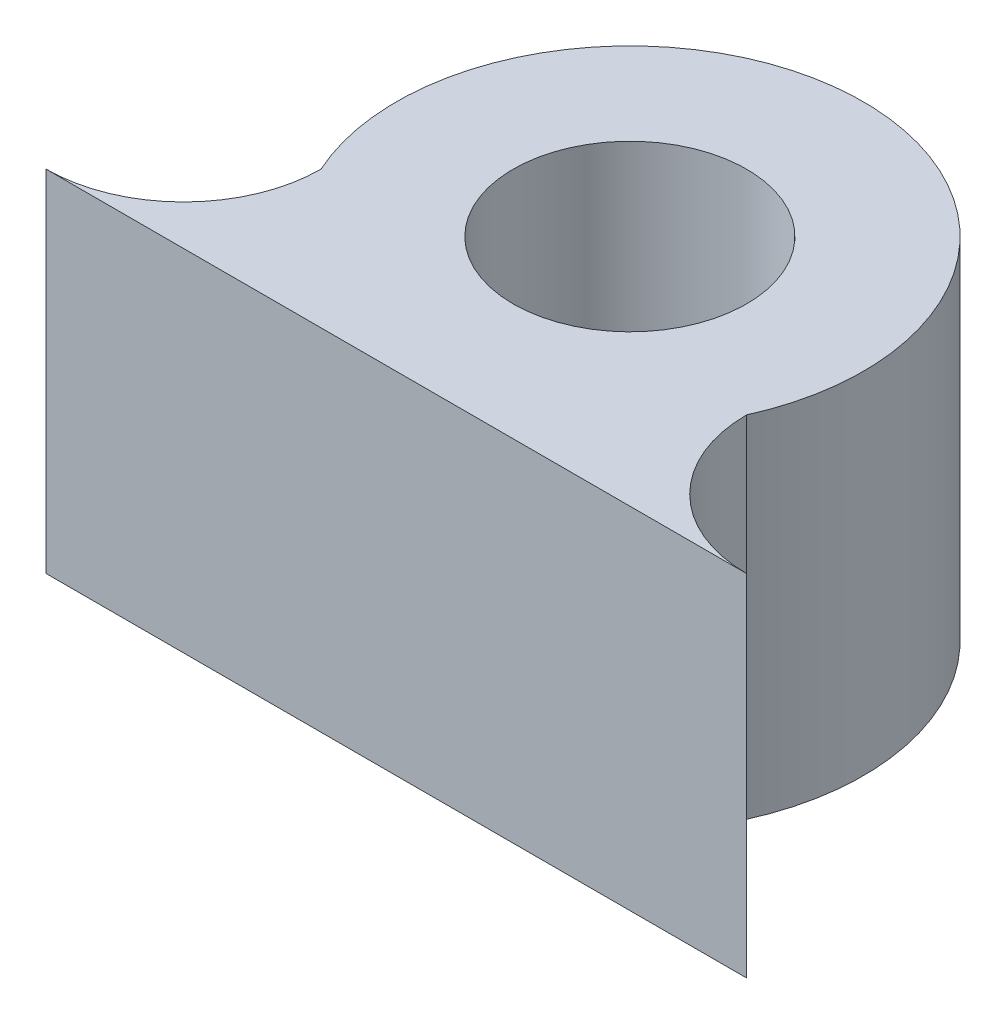
ISO-10303-21;
HEADER;
FILE_DESCRIPTION(('STEP AP214'),'2;1');
FILE_NAME('part.step','',(''),(''),'','','');
FILE_SCHEMA(('AUTOMOTIVE_DESIGN { 1 0 10303 214 1 1 1 1 }'));
ENDSEC;
DATA;
#1=APPLICATION_CONTEXT('core data for automotive mechanical design processes');
#2=APPLICATION_PROTOCOL_DEFINITION('international standard','automotive_design',2000,#1);
#3=PRODUCT_CONTEXT('',#1,'mechanical');
#4=PRODUCT('Part','Part','',(#3));
#5=PRODUCT_RELATED_PRODUCT_CATEGORY('part','',(#4));
#6=PRODUCT_DEFINITION_FORMATION('','',#4);
#7=PRODUCT_DEFINITION_CONTEXT('part definition',#1,'design');
#8=PRODUCT_DEFINITION('design','',#6,#7);
#9=PRODUCT_DEFINITION_SHAPE('','',#8);
#10=(LENGTH_UNIT() NAMED_UNIT(*) SI_UNIT(.MILLI.,.METRE.));
#11=(NAMED_UNIT(*) PLANE_ANGLE_UNIT() SI_UNIT($,.RADIAN.));
#12=(NAMED_UNIT(*) SI_UNIT($,.STERADIAN.) SOLID_ANGLE_UNIT());
#13=UNCERTAINTY_MEASURE_WITH_UNIT(LENGTH_MEASURE(1.E-05),#10,'distance_accuracy_value','');
#14=(GEOMETRIC_REPRESENTATION_CONTEXT(3) GLOBAL_UNCERTAINTY_ASSIGNED_CONTEXT((#13)) GLOBAL_UNIT_ASSIGNED_CONTEXT((#10,
#11,#12)) REPRESENTATION_CONTEXT('',''));
#15=CARTESIAN_POINT('',(0.,0.,0.));
#16=DIRECTION('',(0.,0.,1.));
#17=DIRECTION('',(1.,0.,0.));
#18=AXIS2_PLACEMENT_3D('',#15,#16,#17);
#19=CARTESIAN_POINT('',(0.,3.,0.));
#20=DIRECTION('',(0.,-1.,0.));
#21=DIRECTION('',(0.,0.,-1.));
#22=AXIS2_PLACEMENT_3D('',#19,#20,#21);
#23=CYLINDRICAL_SURFACE('',#22,2.);
#24=CARTESIAN_POINT('',(0.,3.,0.));
#25=DIRECTION('',(0.,1.,0.));
#26=DIRECTION('',(0.,0.,1.));
#27=AXIS2_PLACEMENT_3D('',#24,#25,#26);
#28=CIRCLE('',#27,2.);
#29=CARTESIAN_POINT('',(1.8228756555323,3.,0.822875655532295));
#30=VERTEX_POINT('',#29);
#31=CARTESIAN_POINT('',(-1.82287565553229,3.,0.822875655532296));
#32=VERTEX_POINT('',#31);
#33=EDGE_CURVE('E12',#30,#32,#28,.T.);
#34=ORIENTED_EDGE('',*,*,#33,.F.);
#35=DIRECTION('',(0.,1.,0.));
#36=VECTOR('',#35,1.);
#37=CARTESIAN_POINT('',(1.8228756555323,0.,0.822875655532295));
#38=LINE('',#37,#36);
#39=CARTESIAN_POINT('',(1.8228756555323,0.,0.822875655532295));
#40=VERTEX_POINT('',#39);
#41=EDGE_CURVE('E127',#40,#30,#38,.T.);
#42=ORIENTED_EDGE('',*,*,#41,.F.);
#43=CARTESIAN_POINT('',(0.,0.,0.));
#44=DIRECTION('',(0.,1.,0.));
#45=DIRECTION('',(0.,0.,1.));
#46=AXIS2_PLACEMENT_3D('',#43,#44,#45);
#47=CIRCLE('',#46,2.);
#48=CARTESIAN_POINT('',(-1.82287565553229,0.,0.822875655532296));
#49=VERTEX_POINT('',#48);
#50=EDGE_CURVE('E68',#40,#49,#47,.T.);
#51=ORIENTED_EDGE('',*,*,#50,.T.);
#52=DIRECTION('',(0.,1.,0.));
#53=VECTOR('',#52,1.);
#54=CARTESIAN_POINT('',(-1.82287565553229,0.,0.822875655532296));
#55=LINE('',#54,#53);
#56=EDGE_CURVE('E142',#49,#32,#55,.T.);
#57=ORIENTED_EDGE('',*,*,#56,.T.);
#58=EDGE_LOOP('',(#34,#42,#51,#57));
#59=FACE_BOUND('',#58,.T.);
#60=ADVANCED_FACE('F65',(#59),#23,.T.);
#61=CARTESIAN_POINT('',(0.,3.,0.));
#62=DIRECTION('',(0.,1.,0.));
#63=DIRECTION('',(0.,0.,1.));
#64=AXIS2_PLACEMENT_3D('',#61,#62,#63);
#65=PLANE('',#64);
#66=DIRECTION('',(-1.,0.,0.));
#67=VECTOR('',#66,1.);
#68=CARTESIAN_POINT('',(0.,3.,2.));
#69=LINE('',#68,#67);
#70=CARTESIAN_POINT('',(3.,3.,2.));
#71=VERTEX_POINT('',#70);
#72=CARTESIAN_POINT('',(-3.,3.,2.));
#73=VERTEX_POINT('',#72);
#74=EDGE_CURVE('E93',#71,#73,#69,.T.);
#75=ORIENTED_EDGE('',*,*,#74,.F.);
#76=CARTESIAN_POINT('',(3.,3.,0.822875655532295));
#77=DIRECTION('',(0.,1.,0.));
#78=DIRECTION('',(0.,0.,1.));
#79=AXIS2_PLACEMENT_3D('',#76,#77,#78);
#80=CIRCLE('',#79,1.17712434446771);
#81=EDGE_CURVE('E115',#71,#30,#80,.F.);
#82=ORIENTED_EDGE('',*,*,#81,.T.);
#83=ORIENTED_EDGE('',*,*,#33,.T.);
#84=CARTESIAN_POINT('',(-3.,3.,0.822875655532296));
#85=DIRECTION('',(0.,1.,0.));
#86=DIRECTION('',(0.,0.,1.));
#87=AXIS2_PLACEMENT_3D('',#84,#85,#86);
#88=CIRCLE('',#87,1.17712434446771);
#89=EDGE_CURVE('E118',#73,#32,#88,.T.);
#90=ORIENTED_EDGE('',*,*,#89,.F.);
#91=EDGE_LOOP('',(#75,#82,#83,#90));
#92=FACE_BOUND('',#91,.T.);
#93=CARTESIAN_POINT('',(0.,3.,0.));
#94=DIRECTION('',(0.,1.,0.));
#95=DIRECTION('',(0.,0.,1.));
#96=AXIS2_PLACEMENT_3D('',#93,#94,#95);
#97=CIRCLE('',#96,1.);
#98=CARTESIAN_POINT('',(0.,3.,1.));
#99=VERTEX_POINT('',#98);
#100=EDGE_CURVE('E148',#99,#99,#97,.T.);
#101=ORIENTED_EDGE('',*,*,#100,.F.);
#102=EDGE_LOOP('',(#101));
#103=FACE_BOUND('',#102,.T.);
#104=ADVANCED_FACE('F112',(#92,#103),#65,.T.);
#105=CARTESIAN_POINT('',(0.,0.,0.));
#106=DIRECTION('',(0.,1.,0.));
#107=DIRECTION('',(0.,0.,1.));
#108=AXIS2_PLACEMENT_3D('',#105,#106,#107);
#109=PLANE('',#108);
#110=ORIENTED_EDGE('',*,*,#50,.F.);
#111=CARTESIAN_POINT('',(3.,0.,0.822875655532295));
#112=DIRECTION('',(0.,1.,0.));
#113=DIRECTION('',(0.,0.,1.));
#114=AXIS2_PLACEMENT_3D('',#111,#112,#113);
#115=CIRCLE('',#114,1.17712434446771);
#116=CARTESIAN_POINT('',(3.,0.,2.));
#117=VERTEX_POINT('',#116);
#118=EDGE_CURVE('E102',#117,#40,#115,.F.);
#119=ORIENTED_EDGE('',*,*,#118,.F.);
#120=DIRECTION('',(-1.,0.,0.));
#121=VECTOR('',#120,1.);
#122=CARTESIAN_POINT('',(0.,0.,2.));
#123=LINE('',#122,#121);
#124=CARTESIAN_POINT('',(-3.,0.,2.));
#125=VERTEX_POINT('',#124);
#126=EDGE_CURVE('E108',#117,#125,#123,.T.);
#127=ORIENTED_EDGE('',*,*,#126,.T.);
#128=CARTESIAN_POINT('',(-3.,0.,0.822875655532296));
#129=DIRECTION('',(0.,1.,0.));
#130=DIRECTION('',(0.,0.,1.));
#131=AXIS2_PLACEMENT_3D('',#128,#129,#130);
#132=CIRCLE('',#131,1.17712434446771);
#133=EDGE_CURVE('E120',#125,#49,#132,.T.);
#134=ORIENTED_EDGE('',*,*,#133,.T.);
#135=EDGE_LOOP('',(#110,#119,#127,#134));
#136=FACE_BOUND('',#135,.T.);
#137=CARTESIAN_POINT('',(0.,0.,0.));
#138=DIRECTION('',(0.,1.,0.));
#139=DIRECTION('',(0.,0.,1.));
#140=AXIS2_PLACEMENT_3D('',#137,#138,#139);
#141=CIRCLE('',#140,1.);
#142=CARTESIAN_POINT('',(0.,0.,1.));
#143=VERTEX_POINT('',#142);
#144=EDGE_CURVE('E145',#143,#143,#141,.T.);
#145=ORIENTED_EDGE('',*,*,#144,.T.);
#146=EDGE_LOOP('',(#145));
#147=FACE_BOUND('',#146,.T.);
#148=ADVANCED_FACE('F156',(#136,#147),#109,.F.);
#149=CARTESIAN_POINT('',(0.,3.,0.));
#150=DIRECTION('',(0.,-1.,0.));
#151=DIRECTION('',(0.,0.,-1.));
#152=AXIS2_PLACEMENT_3D('',#149,#150,#151);
#153=CYLINDRICAL_SURFACE('',#152,1.);
#154=ORIENTED_EDGE('',*,*,#100,.T.);
#155=EDGE_LOOP('',(#154));
#156=FACE_BOUND('',#155,.T.);
#157=ORIENTED_EDGE('',*,*,#144,.F.);
#158=EDGE_LOOP('',(#157));
#159=FACE_BOUND('',#158,.T.);
#160=ADVANCED_FACE('F158',(#156,#159),#153,.F.);
#161=CARTESIAN_POINT('',(-3.,0.,0.822875655532296));
#162=DIRECTION('',(0.,1.,0.));
#163=DIRECTION('',(0.,0.,1.));
#164=AXIS2_PLACEMENT_3D('',#161,#162,#163);
#165=CYLINDRICAL_SURFACE('',#164,1.17712434446771);
#166=ORIENTED_EDGE('',*,*,#89,.T.);
#167=ORIENTED_EDGE('',*,*,#56,.F.);
#168=ORIENTED_EDGE('',*,*,#133,.F.);
#169=DIRECTION('',(0.,1.,0.));
#170=VECTOR('',#169,1.);
#171=CARTESIAN_POINT('',(-3.,0.,2.));
#172=LINE('',#171,#170);
#173=EDGE_CURVE('E140',#125,#73,#172,.T.);
#174=ORIENTED_EDGE('',*,*,#173,.T.);
#175=EDGE_LOOP('',(#166,#167,#168,#174));
#176=FACE_BOUND('',#175,.T.);
#177=ADVANCED_FACE('F160',(#176),#165,.F.);
#178=CARTESIAN_POINT('',(0.,0.,2.));
#179=DIRECTION('',(0.,0.,-1.));
#180=DIRECTION('',(-1.,0.,0.));
#181=AXIS2_PLACEMENT_3D('',#178,#179,#180);
#182=PLANE('',#181);
#183=ORIENTED_EDGE('',*,*,#74,.T.);
#184=ORIENTED_EDGE('',*,*,#173,.F.);
#185=ORIENTED_EDGE('',*,*,#126,.F.);
#186=DIRECTION('',(0.,1.,0.));
#187=VECTOR('',#186,1.);
#188=CARTESIAN_POINT('',(3.,0.,2.));
#189=LINE('',#188,#187);
#190=EDGE_CURVE('E122',#117,#71,#189,.T.);
#191=ORIENTED_EDGE('',*,*,#190,.T.);
#192=EDGE_LOOP('',(#183,#184,#185,#191));
#193=FACE_BOUND('',#192,.T.);
#194=ADVANCED_FACE('F123',(#193),#182,.F.);
#195=CARTESIAN_POINT('',(3.,0.,0.822875655532295));
#196=DIRECTION('',(0.,1.,0.));
#197=DIRECTION('',(0.,0.,1.));
#198=AXIS2_PLACEMENT_3D('',#195,#196,#197);
#199=CYLINDRICAL_SURFACE('',#198,1.17712434446771);
#200=ORIENTED_EDGE('',*,*,#81,.F.);
#201=ORIENTED_EDGE('',*,*,#190,.F.);
#202=ORIENTED_EDGE('',*,*,#118,.T.);
#203=ORIENTED_EDGE('',*,*,#41,.T.);
#204=EDGE_LOOP('',(#200,#201,#202,#203));
#205=FACE_BOUND('',#204,.T.);
#206=ADVANCED_FACE('F126',(#205),#199,.F.);
#207=CLOSED_SHELL('',(#60,#104,#148,#160,#177,#194,#206));
#208=MANIFOLD_SOLID_BREP('B2',#207);
#209=ADVANCED_BREP_SHAPE_REPRESENTATION('',(#18,#208),#14);
#210=SHAPE_DEFINITION_REPRESENTATION(#9,#209);
ENDSEC;
END-ISO-10303-21;
